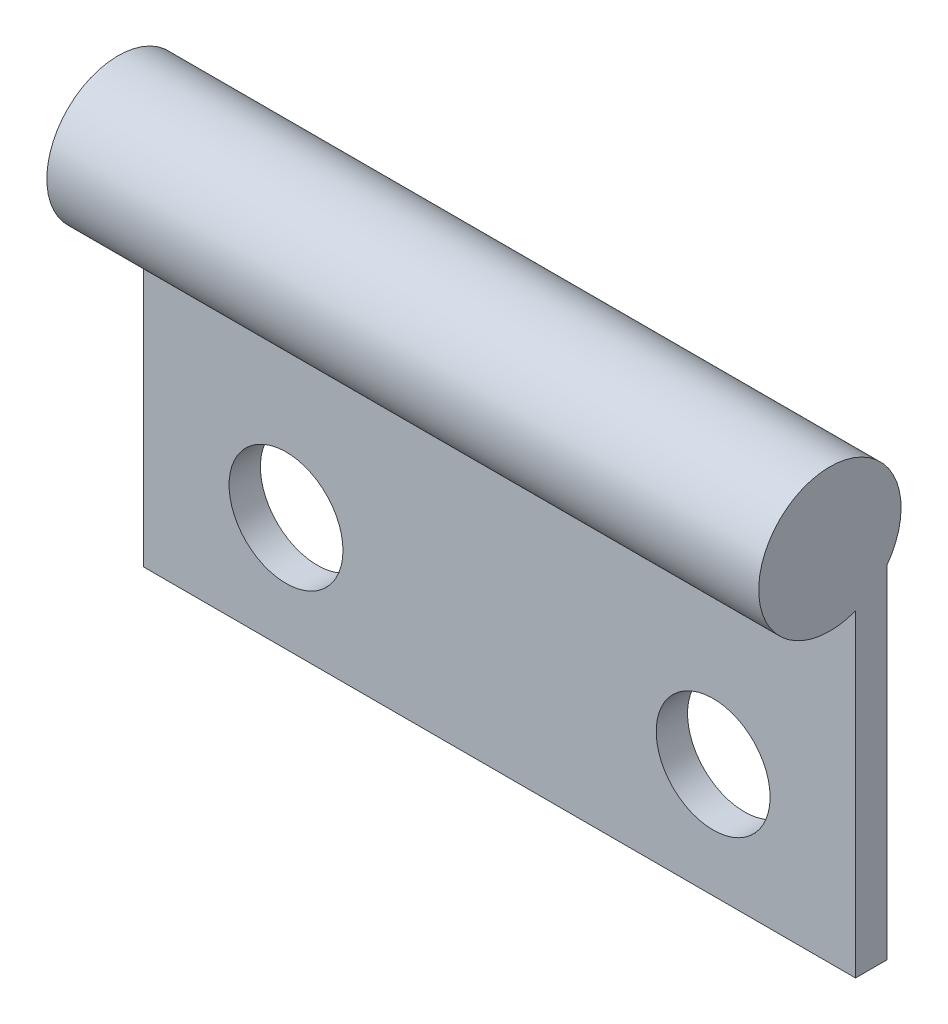
ISO-10303-21;
HEADER;
FILE_DESCRIPTION(('STEP AP214'),'2;1');
FILE_NAME('part.step','',(''),(''),'','','');
FILE_SCHEMA(('AUTOMOTIVE_DESIGN { 1 0 10303 214 1 1 1 1 }'));
ENDSEC;
DATA;
#1=APPLICATION_CONTEXT('core data for automotive mechanical design processes');
#2=APPLICATION_PROTOCOL_DEFINITION('international standard','automotive_design',2000,#1);
#3=PRODUCT_CONTEXT('',#1,'mechanical');
#4=PRODUCT('Part','Part','',(#3));
#5=PRODUCT_RELATED_PRODUCT_CATEGORY('part','',(#4));
#6=PRODUCT_DEFINITION_FORMATION('','',#4);
#7=PRODUCT_DEFINITION_CONTEXT('part definition',#1,'design');
#8=PRODUCT_DEFINITION('design','',#6,#7);
#9=PRODUCT_DEFINITION_SHAPE('','',#8);
#10=(LENGTH_UNIT() NAMED_UNIT(*) SI_UNIT(.MILLI.,.METRE.));
#11=(NAMED_UNIT(*) PLANE_ANGLE_UNIT() SI_UNIT($,.RADIAN.));
#12=(NAMED_UNIT(*) SI_UNIT($,.STERADIAN.) SOLID_ANGLE_UNIT());
#13=UNCERTAINTY_MEASURE_WITH_UNIT(LENGTH_MEASURE(1.E-05),#10,'distance_accuracy_value','');
#14=(GEOMETRIC_REPRESENTATION_CONTEXT(3) GLOBAL_UNCERTAINTY_ASSIGNED_CONTEXT((#13)) GLOBAL_UNIT_ASSIGNED_CONTEXT((#10,
#11,#12)) REPRESENTATION_CONTEXT('',''));
#15=CARTESIAN_POINT('',(0.,0.,0.));
#16=DIRECTION('',(0.,0.,1.));
#17=DIRECTION('',(1.,0.,0.));
#18=AXIS2_PLACEMENT_3D('',#15,#16,#17);
#19=CARTESIAN_POINT('',(0.,0.,1.1));
#20=DIRECTION('',(0.,0.,-1.));
#21=DIRECTION('',(-1.,0.,0.));
#22=AXIS2_PLACEMENT_3D('',#19,#20,#21);
#23=PLANE('',#22);
#24=DIRECTION('',(0.,1.,0.));
#25=VECTOR('',#24,1.);
#26=CARTESIAN_POINT('',(25.,0.,1.1));
#27=LINE('',#26,#25);
#28=CARTESIAN_POINT('',(25.,0.,1.1));
#29=VERTEX_POINT('',#28);
#30=CARTESIAN_POINT('',(25.,11.1676192420619,1.1));
#31=VERTEX_POINT('',#30);
#32=EDGE_CURVE('E95',#29,#31,#27,.T.);
#33=ORIENTED_EDGE('',*,*,#32,.T.);
#34=DIRECTION('',(-1.,0.,0.));
#35=VECTOR('',#34,1.);
#36=CARTESIAN_POINT('',(32.0710678118655,11.1676192420619,1.1));
#37=LINE('',#36,#35);
#38=CARTESIAN_POINT('',(0.,11.1676192420619,1.1));
#39=VERTEX_POINT('',#38);
#40=EDGE_CURVE('E57',#31,#39,#37,.T.);
#41=ORIENTED_EDGE('',*,*,#40,.T.);
#42=DIRECTION('',(0.,-1.,0.));
#43=VECTOR('',#42,1.);
#44=CARTESIAN_POINT('',(0.,0.,1.1));
#45=LINE('',#44,#43);
#46=CARTESIAN_POINT('',(0.,0.,1.1));
#47=VERTEX_POINT('',#46);
#48=EDGE_CURVE('E80',#39,#47,#45,.T.);
#49=ORIENTED_EDGE('',*,*,#48,.T.);
#50=DIRECTION('',(1.,0.,0.));
#51=VECTOR('',#50,1.);
#52=CARTESIAN_POINT('',(0.,0.,1.1));
#53=LINE('',#52,#51);
#54=EDGE_CURVE('E83',#47,#29,#53,.T.);
#55=ORIENTED_EDGE('',*,*,#54,.T.);
#56=EDGE_LOOP('',(#33,#41,#49,#55));
#57=FACE_BOUND('',#56,.T.);
#58=CARTESIAN_POINT('',(5.,4.,1.1));
#59=DIRECTION('',(0.,0.,1.));
#60=DIRECTION('',(1.,0.,0.));
#61=AXIS2_PLACEMENT_3D('',#58,#59,#60);
#62=CIRCLE('',#61,2.);
#63=CARTESIAN_POINT('',(7.,4.,1.1));
#64=VERTEX_POINT('',#63);
#65=EDGE_CURVE('E99',#64,#64,#62,.T.);
#66=ORIENTED_EDGE('',*,*,#65,.F.);
#67=EDGE_LOOP('',(#66));
#68=FACE_BOUND('',#67,.T.);
#69=CARTESIAN_POINT('',(20.,4.,1.1));
#70=DIRECTION('',(0.,0.,1.));
#71=DIRECTION('',(1.,0.,0.));
#72=AXIS2_PLACEMENT_3D('',#69,#70,#71);
#73=CIRCLE('',#72,2.);
#74=CARTESIAN_POINT('',(22.,4.,1.1));
#75=VERTEX_POINT('',#74);
#76=EDGE_CURVE('E113',#75,#75,#73,.T.);
#77=ORIENTED_EDGE('',*,*,#76,.F.);
#78=EDGE_LOOP('',(#77));
#79=FACE_BOUND('',#78,.T.);
#80=ADVANCED_FACE('F42',(#57,#68,#79),#23,.F.);
#81=CARTESIAN_POINT('',(0.,0.,0.));
#82=DIRECTION('',(0.,0.,-1.));
#83=DIRECTION('',(-1.,0.,0.));
#84=AXIS2_PLACEMENT_3D('',#81,#82,#83);
#85=PLANE('',#84);
#86=DIRECTION('',(-1.,0.,0.));
#87=VECTOR('',#86,1.);
#88=CARTESIAN_POINT('',(32.0710678118655,12.,0.));
#89=LINE('',#88,#87);
#90=CARTESIAN_POINT('',(25.,12.,0.));
#91=VERTEX_POINT('',#90);
#92=CARTESIAN_POINT('',(0.,12.,0.));
#93=VERTEX_POINT('',#92);
#94=EDGE_CURVE('E122',#91,#93,#89,.T.);
#95=ORIENTED_EDGE('',*,*,#94,.F.);
#96=DIRECTION('',(0.,1.,0.));
#97=VECTOR('',#96,1.);
#98=CARTESIAN_POINT('',(25.,0.,0.));
#99=LINE('',#98,#97);
#100=CARTESIAN_POINT('',(25.,0.,0.));
#101=VERTEX_POINT('',#100);
#102=EDGE_CURVE('E89',#101,#91,#99,.T.);
#103=ORIENTED_EDGE('',*,*,#102,.F.);
#104=DIRECTION('',(1.,0.,0.));
#105=VECTOR('',#104,1.);
#106=CARTESIAN_POINT('',(0.,0.,0.));
#107=LINE('',#106,#105);
#108=CARTESIAN_POINT('',(0.,0.,0.));
#109=VERTEX_POINT('',#108);
#110=EDGE_CURVE('E98',#109,#101,#107,.T.);
#111=ORIENTED_EDGE('',*,*,#110,.F.);
#112=DIRECTION('',(0.,-1.,0.));
#113=VECTOR('',#112,1.);
#114=CARTESIAN_POINT('',(0.,0.,0.));
#115=LINE('',#114,#113);
#116=EDGE_CURVE('E65',#93,#109,#115,.T.);
#117=ORIENTED_EDGE('',*,*,#116,.F.);
#118=EDGE_LOOP('',(#95,#103,#111,#117));
#119=FACE_BOUND('',#118,.T.);
#120=CARTESIAN_POINT('',(5.,4.,0.));
#121=DIRECTION('',(0.,0.,1.));
#122=DIRECTION('',(1.,0.,0.));
#123=AXIS2_PLACEMENT_3D('',#120,#121,#122);
#124=CIRCLE('',#123,2.);
#125=CARTESIAN_POINT('',(7.,4.,0.));
#126=VERTEX_POINT('',#125);
#127=EDGE_CURVE('E110',#126,#126,#124,.T.);
#128=ORIENTED_EDGE('',*,*,#127,.T.);
#129=EDGE_LOOP('',(#128));
#130=FACE_BOUND('',#129,.T.);
#131=CARTESIAN_POINT('',(20.,4.,0.));
#132=DIRECTION('',(0.,0.,1.));
#133=DIRECTION('',(1.,0.,0.));
#134=AXIS2_PLACEMENT_3D('',#131,#132,#133);
#135=CIRCLE('',#134,2.);
#136=CARTESIAN_POINT('',(22.,4.,0.));
#137=VERTEX_POINT('',#136);
#138=EDGE_CURVE('E116',#137,#137,#135,.T.);
#139=ORIENTED_EDGE('',*,*,#138,.T.);
#140=EDGE_LOOP('',(#139));
#141=FACE_BOUND('',#140,.T.);
#142=ADVANCED_FACE('F102',(#119,#130,#141),#85,.T.);
#143=CARTESIAN_POINT('',(0.,0.,1.1));
#144=DIRECTION('',(1.,0.,0.));
#145=DIRECTION('',(0.,0.,-1.));
#146=AXIS2_PLACEMENT_3D('',#143,#144,#145);
#147=PLANE('',#146);
#148=ORIENTED_EDGE('',*,*,#48,.F.);
#149=CARTESIAN_POINT('',(0.,13.5,2.));
#150=DIRECTION('',(-1.,0.,0.));
#151=DIRECTION('',(0.,0.,1.));
#152=AXIS2_PLACEMENT_3D('',#149,#150,#151);
#153=CIRCLE('',#152,2.5);
#154=EDGE_CURVE('E97',#39,#93,#153,.T.);
#155=ORIENTED_EDGE('',*,*,#154,.T.);
#156=ORIENTED_EDGE('',*,*,#116,.T.);
#157=DIRECTION('',(0.,0.,-1.));
#158=VECTOR('',#157,1.);
#159=CARTESIAN_POINT('',(0.,0.,1.1));
#160=LINE('',#159,#158);
#161=EDGE_CURVE('E11',#47,#109,#160,.T.);
#162=ORIENTED_EDGE('',*,*,#161,.F.);
#163=EDGE_LOOP('',(#148,#155,#156,#162));
#164=FACE_BOUND('',#163,.T.);
#165=ADVANCED_FACE('F44',(#164),#147,.F.);
#166=CARTESIAN_POINT('',(0.,0.,1.1));
#167=DIRECTION('',(0.,1.,0.));
#168=DIRECTION('',(0.,0.,1.));
#169=AXIS2_PLACEMENT_3D('',#166,#167,#168);
#170=PLANE('',#169);
#171=ORIENTED_EDGE('',*,*,#110,.T.);
#172=DIRECTION('',(0.,0.,-1.));
#173=VECTOR('',#172,1.);
#174=CARTESIAN_POINT('',(25.,0.,1.1));
#175=LINE('',#174,#173);
#176=EDGE_CURVE('E50',#29,#101,#175,.T.);
#177=ORIENTED_EDGE('',*,*,#176,.F.);
#178=ORIENTED_EDGE('',*,*,#54,.F.);
#179=ORIENTED_EDGE('',*,*,#161,.T.);
#180=EDGE_LOOP('',(#171,#177,#178,#179));
#181=FACE_BOUND('',#180,.T.);
#182=ADVANCED_FACE('F92',(#181),#170,.F.);
#183=CARTESIAN_POINT('',(25.,0.,1.1));
#184=DIRECTION('',(-1.,0.,0.));
#185=DIRECTION('',(0.,0.,1.));
#186=AXIS2_PLACEMENT_3D('',#183,#184,#185);
#187=PLANE('',#186);
#188=ORIENTED_EDGE('',*,*,#102,.T.);
#189=CARTESIAN_POINT('',(25.,13.5,2.));
#190=DIRECTION('',(-1.,0.,0.));
#191=DIRECTION('',(0.,0.,1.));
#192=AXIS2_PLACEMENT_3D('',#189,#190,#191);
#193=CIRCLE('',#192,2.5);
#194=EDGE_CURVE('E124',#91,#31,#193,.F.);
#195=ORIENTED_EDGE('',*,*,#194,.T.);
#196=ORIENTED_EDGE('',*,*,#32,.F.);
#197=ORIENTED_EDGE('',*,*,#176,.T.);
#198=EDGE_LOOP('',(#188,#195,#196,#197));
#199=FACE_BOUND('',#198,.T.);
#200=ADVANCED_FACE('F128',(#199),#187,.F.);
#201=CARTESIAN_POINT('',(5.,4.,1.1));
#202=DIRECTION('',(0.,0.,-1.));
#203=DIRECTION('',(-1.,0.,0.));
#204=AXIS2_PLACEMENT_3D('',#201,#202,#203);
#205=CYLINDRICAL_SURFACE('',#204,2.);
#206=ORIENTED_EDGE('',*,*,#65,.T.);
#207=EDGE_LOOP('',(#206));
#208=FACE_BOUND('',#207,.T.);
#209=ORIENTED_EDGE('',*,*,#127,.F.);
#210=EDGE_LOOP('',(#209));
#211=FACE_BOUND('',#210,.T.);
#212=ADVANCED_FACE('F137',(#208,#211),#205,.F.);
#213=CARTESIAN_POINT('',(20.,4.,1.1));
#214=DIRECTION('',(0.,0.,-1.));
#215=DIRECTION('',(-1.,0.,0.));
#216=AXIS2_PLACEMENT_3D('',#213,#214,#215);
#217=CYLINDRICAL_SURFACE('',#216,2.);
#218=ORIENTED_EDGE('',*,*,#76,.T.);
#219=EDGE_LOOP('',(#218));
#220=FACE_BOUND('',#219,.T.);
#221=ORIENTED_EDGE('',*,*,#138,.F.);
#222=EDGE_LOOP('',(#221));
#223=FACE_BOUND('',#222,.T.);
#224=ADVANCED_FACE('F132',(#220,#223),#217,.F.);
#225=CARTESIAN_POINT('',(32.0710678118655,13.5,2.));
#226=DIRECTION('',(-1.,0.,0.));
#227=DIRECTION('',(0.,0.,1.));
#228=AXIS2_PLACEMENT_3D('',#225,#226,#227);
#229=CYLINDRICAL_SURFACE('',#228,2.5);
#230=ORIENTED_EDGE('',*,*,#40,.F.);
#231=ORIENTED_EDGE('',*,*,#194,.F.);
#232=ORIENTED_EDGE('',*,*,#94,.T.);
#233=ORIENTED_EDGE('',*,*,#154,.F.);
#234=EDGE_LOOP('',(#230,#231,#232,#233));
#235=FACE_BOUND('',#234,.T.);
#236=ADVANCED_FACE('F130',(#235),#229,.T.);
#237=CLOSED_SHELL('',(#80,#142,#165,#182,#200,#212,#224,#236));
#238=MANIFOLD_SOLID_BREP('B2',#237);
#239=ADVANCED_BREP_SHAPE_REPRESENTATION('',(#18,#238),#14);
#240=SHAPE_DEFINITION_REPRESENTATION(#9,#239);
ENDSEC;
END-ISO-10303-21;
